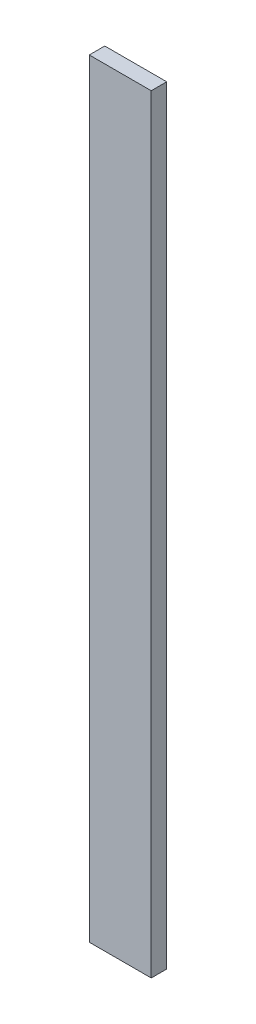
ISO-10303-21;
HEADER;
FILE_DESCRIPTION(('STEP AP214'),'2;1');
FILE_NAME('part.step','',(''),(''),'','','');
FILE_SCHEMA(('AUTOMOTIVE_DESIGN { 1 0 10303 214 1 1 1 1 }'));
ENDSEC;
DATA;
#1=APPLICATION_CONTEXT('core data for automotive mechanical design processes');
#2=APPLICATION_PROTOCOL_DEFINITION('international standard','automotive_design',2000,#1);
#3=PRODUCT_CONTEXT('',#1,'mechanical');
#4=PRODUCT('Part','Part','',(#3));
#5=PRODUCT_RELATED_PRODUCT_CATEGORY('part','',(#4));
#6=PRODUCT_DEFINITION_FORMATION('','',#4);
#7=PRODUCT_DEFINITION_CONTEXT('part definition',#1,'design');
#8=PRODUCT_DEFINITION('design','',#6,#7);
#9=PRODUCT_DEFINITION_SHAPE('','',#8);
#10=(LENGTH_UNIT() NAMED_UNIT(*) SI_UNIT(.MILLI.,.METRE.));
#11=(NAMED_UNIT(*) PLANE_ANGLE_UNIT() SI_UNIT($,.RADIAN.));
#12=(NAMED_UNIT(*) SI_UNIT($,.STERADIAN.) SOLID_ANGLE_UNIT());
#13=UNCERTAINTY_MEASURE_WITH_UNIT(LENGTH_MEASURE(1.E-05),#10,'distance_accuracy_value','');
#14=(GEOMETRIC_REPRESENTATION_CONTEXT(3) GLOBAL_UNCERTAINTY_ASSIGNED_CONTEXT((#13)) GLOBAL_UNIT_ASSIGNED_CONTEXT((#10,
#11,#12)) REPRESENTATION_CONTEXT('',''));
#15=CARTESIAN_POINT('',(0.,0.,0.));
#16=DIRECTION('',(0.,0.,1.));
#17=DIRECTION('',(1.,0.,0.));
#18=AXIS2_PLACEMENT_3D('',#15,#16,#17);
#19=CARTESIAN_POINT('',(-0.412749646294758,295.773164333255,1.5875));
#20=DIRECTION('',(1.,0.,0.));
#21=DIRECTION('',(0.,0.,-1.));
#22=AXIS2_PLACEMENT_3D('',#19,#20,#21);
#23=PLANE('',#22);
#24=DIRECTION('',(0.,-1.,0.));
#25=VECTOR('',#24,1.);
#26=CARTESIAN_POINT('',(-0.412749646294758,295.773164333255,0.));
#27=LINE('',#26,#25);
#28=CARTESIAN_POINT('',(-0.412749646294758,295.773164333255,0.));
#29=VERTEX_POINT('',#28);
#30=CARTESIAN_POINT('',(-0.412749646294758,217.032016312424,0.));
#31=VERTEX_POINT('',#30);
#32=EDGE_CURVE('E95',#29,#31,#27,.T.);
#33=ORIENTED_EDGE('',*,*,#32,.T.);
#34=DIRECTION('',(0.,0.,-1.));
#35=VECTOR('',#34,1.);
#36=CARTESIAN_POINT('',(-0.412749646294758,217.032016312424,1.5875));
#37=LINE('',#36,#35);
#38=CARTESIAN_POINT('',(-0.412749646294758,217.032016312424,1.5875));
#39=VERTEX_POINT('',#38);
#40=EDGE_CURVE('E11',#39,#31,#37,.T.);
#41=ORIENTED_EDGE('',*,*,#40,.F.);
#42=DIRECTION('',(0.,-1.,0.));
#43=VECTOR('',#42,1.);
#44=CARTESIAN_POINT('',(-0.412749646294758,295.773164333255,1.5875));
#45=LINE('',#44,#43);
#46=CARTESIAN_POINT('',(-0.412749646294758,295.773164333255,1.5875));
#47=VERTEX_POINT('',#46);
#48=EDGE_CURVE('E83',#47,#39,#45,.T.);
#49=ORIENTED_EDGE('',*,*,#48,.F.);
#50=DIRECTION('',(0.,0.,-1.));
#51=VECTOR('',#50,1.);
#52=CARTESIAN_POINT('',(-0.412749646294758,295.773164333255,1.5875));
#53=LINE('',#52,#51);
#54=EDGE_CURVE('E91',#47,#29,#53,.T.);
#55=ORIENTED_EDGE('',*,*,#54,.T.);
#56=EDGE_LOOP('',(#33,#41,#49,#55));
#57=FACE_BOUND('',#56,.T.);
#58=ADVANCED_FACE('F32',(#57),#23,.F.);
#59=CARTESIAN_POINT('',(-0.412749646294758,217.032016312424,1.5875));
#60=DIRECTION('',(0.,1.,0.));
#61=DIRECTION('',(0.,0.,1.));
#62=AXIS2_PLACEMENT_3D('',#59,#60,#61);
#63=PLANE('',#62);
#64=DIRECTION('',(1.,0.,0.));
#65=VECTOR('',#64,1.);
#66=CARTESIAN_POINT('',(-0.412749646294758,217.032016312424,0.));
#67=LINE('',#66,#65);
#68=CARTESIAN_POINT('',(5.93725035370524,217.032016312424,0.));
#69=VERTEX_POINT('',#68);
#70=EDGE_CURVE('E87',#31,#69,#67,.T.);
#71=ORIENTED_EDGE('',*,*,#70,.T.);
#72=DIRECTION('',(0.,0.,-1.));
#73=VECTOR('',#72,1.);
#74=CARTESIAN_POINT('',(5.93725035370524,217.032016312424,1.5875));
#75=LINE('',#74,#73);
#76=CARTESIAN_POINT('',(5.93725035370524,217.032016312424,1.5875));
#77=VERTEX_POINT('',#76);
#78=EDGE_CURVE('E40',#77,#69,#75,.T.);
#79=ORIENTED_EDGE('',*,*,#78,.F.);
#80=DIRECTION('',(1.,0.,0.));
#81=VECTOR('',#80,1.);
#82=CARTESIAN_POINT('',(-0.412749646294758,217.032016312424,1.5875));
#83=LINE('',#82,#81);
#84=EDGE_CURVE('E78',#39,#77,#83,.T.);
#85=ORIENTED_EDGE('',*,*,#84,.F.);
#86=ORIENTED_EDGE('',*,*,#40,.T.);
#87=EDGE_LOOP('',(#71,#79,#85,#86));
#88=FACE_BOUND('',#87,.T.);
#89=ADVANCED_FACE('F86',(#88),#63,.F.);
#90=CARTESIAN_POINT('',(5.93725035370524,217.032016312424,1.5875));
#91=DIRECTION('',(-1.,0.,0.));
#92=DIRECTION('',(0.,0.,1.));
#93=AXIS2_PLACEMENT_3D('',#90,#91,#92);
#94=PLANE('',#93);
#95=DIRECTION('',(0.,1.,0.));
#96=VECTOR('',#95,1.);
#97=CARTESIAN_POINT('',(5.93725035370524,217.032016312424,0.));
#98=LINE('',#97,#96);
#99=CARTESIAN_POINT('',(5.93725035370524,295.773164333255,0.));
#100=VERTEX_POINT('',#99);
#101=EDGE_CURVE('E65',#69,#100,#98,.T.);
#102=ORIENTED_EDGE('',*,*,#101,.T.);
#103=DIRECTION('',(0.,0.,-1.));
#104=VECTOR('',#103,1.);
#105=CARTESIAN_POINT('',(5.93725035370524,295.773164333255,1.5875));
#106=LINE('',#105,#104);
#107=CARTESIAN_POINT('',(5.93725035370524,295.773164333255,1.5875));
#108=VERTEX_POINT('',#107);
#109=EDGE_CURVE('E88',#108,#100,#106,.T.);
#110=ORIENTED_EDGE('',*,*,#109,.F.);
#111=DIRECTION('',(0.,1.,0.));
#112=VECTOR('',#111,1.);
#113=CARTESIAN_POINT('',(5.93725035370524,217.032016312424,1.5875));
#114=LINE('',#113,#112);
#115=EDGE_CURVE('E81',#77,#108,#114,.T.);
#116=ORIENTED_EDGE('',*,*,#115,.F.);
#117=ORIENTED_EDGE('',*,*,#78,.T.);
#118=EDGE_LOOP('',(#102,#110,#116,#117));
#119=FACE_BOUND('',#118,.T.);
#120=ADVANCED_FACE('F89',(#119),#94,.F.);
#121=CARTESIAN_POINT('',(5.93725035370524,295.773164333255,1.5875));
#122=DIRECTION('',(0.,-1.,0.));
#123=DIRECTION('',(0.,0.,-1.));
#124=AXIS2_PLACEMENT_3D('',#121,#122,#123);
#125=PLANE('',#124);
#126=DIRECTION('',(-1.,0.,0.));
#127=VECTOR('',#126,1.);
#128=CARTESIAN_POINT('',(5.93725035370524,295.773164333255,0.));
#129=LINE('',#128,#127);
#130=EDGE_CURVE('E71',#100,#29,#129,.T.);
#131=ORIENTED_EDGE('',*,*,#130,.T.);
#132=ORIENTED_EDGE('',*,*,#54,.F.);
#133=DIRECTION('',(-1.,0.,0.));
#134=VECTOR('',#133,1.);
#135=CARTESIAN_POINT('',(5.93725035370524,295.773164333255,1.5875));
#136=LINE('',#135,#134);
#137=EDGE_CURVE('E48',#108,#47,#136,.T.);
#138=ORIENTED_EDGE('',*,*,#137,.F.);
#139=ORIENTED_EDGE('',*,*,#109,.T.);
#140=EDGE_LOOP('',(#131,#132,#138,#139));
#141=FACE_BOUND('',#140,.T.);
#142=ADVANCED_FACE('F102',(#141),#125,.F.);
#143=CARTESIAN_POINT('',(0.,0.,1.5875));
#144=DIRECTION('',(0.,0.,1.));
#145=DIRECTION('',(1.,0.,0.));
#146=AXIS2_PLACEMENT_3D('',#143,#144,#145);
#147=PLANE('',#146);
#148=ORIENTED_EDGE('',*,*,#48,.T.);
#149=ORIENTED_EDGE('',*,*,#84,.T.);
#150=ORIENTED_EDGE('',*,*,#115,.T.);
#151=ORIENTED_EDGE('',*,*,#137,.T.);
#152=EDGE_LOOP('',(#148,#149,#150,#151));
#153=FACE_BOUND('',#152,.T.);
#154=ADVANCED_FACE('F79',(#153),#147,.T.);
#155=CARTESIAN_POINT('',(0.,0.,0.));
#156=DIRECTION('',(0.,0.,1.));
#157=DIRECTION('',(1.,0.,0.));
#158=AXIS2_PLACEMENT_3D('',#155,#156,#157);
#159=PLANE('',#158);
#160=ORIENTED_EDGE('',*,*,#32,.F.);
#161=ORIENTED_EDGE('',*,*,#130,.F.);
#162=ORIENTED_EDGE('',*,*,#101,.F.);
#163=ORIENTED_EDGE('',*,*,#70,.F.);
#164=EDGE_LOOP('',(#160,#161,#162,#163));
#165=FACE_BOUND('',#164,.T.);
#166=ADVANCED_FACE('F105',(#165),#159,.F.);
#167=CLOSED_SHELL('',(#58,#89,#120,#142,#154,#166));
#168=MANIFOLD_SOLID_BREP('B2',#167);
#169=ADVANCED_BREP_SHAPE_REPRESENTATION('',(#18,#168),#14);
#170=SHAPE_DEFINITION_REPRESENTATION(#9,#169);
ENDSEC;
END-ISO-10303-21;
